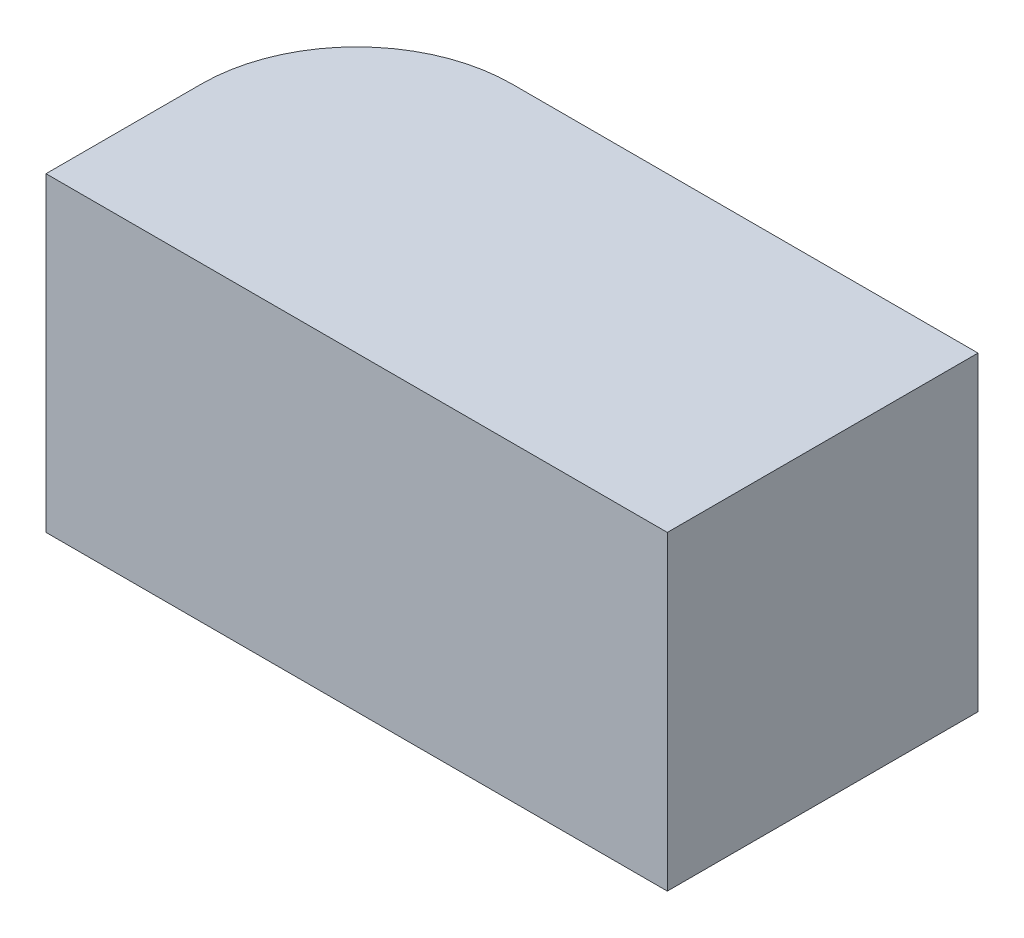
ISO-10303-21;
HEADER;
FILE_DESCRIPTION(('STEP AP214'),'2;1');
FILE_NAME('part.step','',(''),(''),'','','');
FILE_SCHEMA(('AUTOMOTIVE_DESIGN { 1 0 10303 214 1 1 1 1 }'));
ENDSEC;
DATA;
#1=APPLICATION_CONTEXT('core data for automotive mechanical design processes');
#2=APPLICATION_PROTOCOL_DEFINITION('international standard','automotive_design',2000,#1);
#3=PRODUCT_CONTEXT('',#1,'mechanical');
#4=PRODUCT('Part','Part','',(#3));
#5=PRODUCT_RELATED_PRODUCT_CATEGORY('part','',(#4));
#6=PRODUCT_DEFINITION_FORMATION('','',#4);
#7=PRODUCT_DEFINITION_CONTEXT('part definition',#1,'design');
#8=PRODUCT_DEFINITION('design','',#6,#7);
#9=PRODUCT_DEFINITION_SHAPE('','',#8);
#10=(LENGTH_UNIT() NAMED_UNIT(*) SI_UNIT(.MILLI.,.METRE.));
#11=(NAMED_UNIT(*) PLANE_ANGLE_UNIT() SI_UNIT($,.RADIAN.));
#12=(NAMED_UNIT(*) SI_UNIT($,.STERADIAN.) SOLID_ANGLE_UNIT());
#13=UNCERTAINTY_MEASURE_WITH_UNIT(LENGTH_MEASURE(1.E-05),#10,'distance_accuracy_value','');
#14=(GEOMETRIC_REPRESENTATION_CONTEXT(3) GLOBAL_UNCERTAINTY_ASSIGNED_CONTEXT((#13)) GLOBAL_UNIT_ASSIGNED_CONTEXT((#10,
#11,#12)) REPRESENTATION_CONTEXT('',''));
#15=CARTESIAN_POINT('',(0.,0.,0.));
#16=DIRECTION('',(0.,0.,1.));
#17=DIRECTION('',(1.,0.,0.));
#18=AXIS2_PLACEMENT_3D('',#15,#16,#17);
#19=CARTESIAN_POINT('',(-10.,20.,20.));
#20=DIRECTION('',(1.,0.,0.));
#21=DIRECTION('',(0.,0.,-1.));
#22=AXIS2_PLACEMENT_3D('',#19,#20,#21);
#23=PLANE('',#22);
#24=DIRECTION('',(0.,0.,1.));
#25=VECTOR('',#24,1.);
#26=CARTESIAN_POINT('',(-10.,0.,20.));
#27=LINE('',#26,#25);
#28=CARTESIAN_POINT('',(-10.,0.,10.));
#29=VERTEX_POINT('',#28);
#30=CARTESIAN_POINT('',(-10.,0.,20.));
#31=VERTEX_POINT('',#30);
#32=EDGE_CURVE('E118',#29,#31,#27,.T.);
#33=ORIENTED_EDGE('',*,*,#32,.T.);
#34=DIRECTION('',(0.,-1.,0.));
#35=VECTOR('',#34,1.);
#36=CARTESIAN_POINT('',(-10.,20.,20.));
#37=LINE('',#36,#35);
#38=CARTESIAN_POINT('',(-10.,20.,20.));
#39=VERTEX_POINT('',#38);
#40=EDGE_CURVE('E11',#39,#31,#37,.T.);
#41=ORIENTED_EDGE('',*,*,#40,.F.);
#42=DIRECTION('',(0.,0.,1.));
#43=VECTOR('',#42,1.);
#44=CARTESIAN_POINT('',(-10.,20.,20.));
#45=LINE('',#44,#43);
#46=CARTESIAN_POINT('',(-10.,20.,10.));
#47=VERTEX_POINT('',#46);
#48=EDGE_CURVE('E131',#47,#39,#45,.T.);
#49=ORIENTED_EDGE('',*,*,#48,.F.);
#50=DIRECTION('',(0.,-1.,0.));
#51=VECTOR('',#50,1.);
#52=CARTESIAN_POINT('',(-10.,20.,10.));
#53=LINE('',#52,#51);
#54=EDGE_CURVE('E114',#47,#29,#53,.T.);
#55=ORIENTED_EDGE('',*,*,#54,.T.);
#56=EDGE_LOOP('',(#33,#41,#49,#55));
#57=FACE_BOUND('',#56,.T.);
#58=ADVANCED_FACE('F39',(#57),#23,.F.);
#59=CARTESIAN_POINT('',(-10.,20.,20.));
#60=DIRECTION('',(0.,0.,-1.));
#61=DIRECTION('',(-1.,0.,0.));
#62=AXIS2_PLACEMENT_3D('',#59,#60,#61);
#63=PLANE('',#62);
#64=DIRECTION('',(1.,0.,0.));
#65=VECTOR('',#64,1.);
#66=CARTESIAN_POINT('',(-10.,0.,20.));
#67=LINE('',#66,#65);
#68=CARTESIAN_POINT('',(30.,0.,20.));
#69=VERTEX_POINT('',#68);
#70=EDGE_CURVE('E122',#31,#69,#67,.T.);
#71=ORIENTED_EDGE('',*,*,#70,.T.);
#72=DIRECTION('',(0.,-1.,0.));
#73=VECTOR('',#72,1.);
#74=CARTESIAN_POINT('',(30.,20.,20.));
#75=LINE('',#74,#73);
#76=CARTESIAN_POINT('',(30.,20.,20.));
#77=VERTEX_POINT('',#76);
#78=EDGE_CURVE('E48',#77,#69,#75,.T.);
#79=ORIENTED_EDGE('',*,*,#78,.F.);
#80=DIRECTION('',(1.,0.,0.));
#81=VECTOR('',#80,1.);
#82=CARTESIAN_POINT('',(-10.,20.,20.));
#83=LINE('',#82,#81);
#84=EDGE_CURVE('E90',#39,#77,#83,.T.);
#85=ORIENTED_EDGE('',*,*,#84,.F.);
#86=ORIENTED_EDGE('',*,*,#40,.T.);
#87=EDGE_LOOP('',(#71,#79,#85,#86));
#88=FACE_BOUND('',#87,.T.);
#89=ADVANCED_FACE('F153',(#88),#63,.F.);
#90=CARTESIAN_POINT('',(30.,20.,20.));
#91=DIRECTION('',(-1.,0.,0.));
#92=DIRECTION('',(0.,0.,1.));
#93=AXIS2_PLACEMENT_3D('',#90,#91,#92);
#94=PLANE('',#93);
#95=DIRECTION('',(0.,0.,-1.));
#96=VECTOR('',#95,1.);
#97=CARTESIAN_POINT('',(30.,0.,20.));
#98=LINE('',#97,#96);
#99=CARTESIAN_POINT('',(30.,0.,0.));
#100=VERTEX_POINT('',#99);
#101=EDGE_CURVE('E106',#69,#100,#98,.T.);
#102=ORIENTED_EDGE('',*,*,#101,.T.);
#103=DIRECTION('',(0.,-1.,0.));
#104=VECTOR('',#103,1.);
#105=CARTESIAN_POINT('',(30.,20.,0.));
#106=LINE('',#105,#104);
#107=CARTESIAN_POINT('',(30.,20.,0.));
#108=VERTEX_POINT('',#107);
#109=EDGE_CURVE('E103',#108,#100,#106,.T.);
#110=ORIENTED_EDGE('',*,*,#109,.F.);
#111=DIRECTION('',(0.,0.,-1.));
#112=VECTOR('',#111,1.);
#113=CARTESIAN_POINT('',(30.,20.,20.));
#114=LINE('',#113,#112);
#115=EDGE_CURVE('E94',#77,#108,#114,.T.);
#116=ORIENTED_EDGE('',*,*,#115,.F.);
#117=ORIENTED_EDGE('',*,*,#78,.T.);
#118=EDGE_LOOP('',(#102,#110,#116,#117));
#119=FACE_BOUND('',#118,.T.);
#120=ADVANCED_FACE('F104',(#119),#94,.F.);
#121=CARTESIAN_POINT('',(0.,20.,0.));
#122=DIRECTION('',(0.,0.,1.));
#123=DIRECTION('',(1.,0.,0.));
#124=AXIS2_PLACEMENT_3D('',#121,#122,#123);
#125=PLANE('',#124);
#126=DIRECTION('',(-1.,0.,0.));
#127=VECTOR('',#126,1.);
#128=CARTESIAN_POINT('',(0.,0.,0.));
#129=LINE('',#128,#127);
#130=CARTESIAN_POINT('',(0.,0.,0.));
#131=VERTEX_POINT('',#130);
#132=EDGE_CURVE('E76',#100,#131,#129,.T.);
#133=ORIENTED_EDGE('',*,*,#132,.T.);
#134=DIRECTION('',(0.,-1.,0.));
#135=VECTOR('',#134,1.);
#136=CARTESIAN_POINT('',(0.,20.,0.));
#137=LINE('',#136,#135);
#138=CARTESIAN_POINT('',(0.,20.,0.));
#139=VERTEX_POINT('',#138);
#140=EDGE_CURVE('E108',#139,#131,#137,.T.);
#141=ORIENTED_EDGE('',*,*,#140,.F.);
#142=DIRECTION('',(-1.,0.,0.));
#143=VECTOR('',#142,1.);
#144=CARTESIAN_POINT('',(0.,20.,0.));
#145=LINE('',#144,#143);
#146=EDGE_CURVE('E98',#108,#139,#145,.T.);
#147=ORIENTED_EDGE('',*,*,#146,.F.);
#148=ORIENTED_EDGE('',*,*,#109,.T.);
#149=EDGE_LOOP('',(#133,#141,#147,#148));
#150=FACE_BOUND('',#149,.T.);
#151=ADVANCED_FACE('F110',(#150),#125,.F.);
#152=CARTESIAN_POINT('',(0.,20.,10.));
#153=DIRECTION('',(0.,-1.,0.));
#154=DIRECTION('',(0.,0.,-1.));
#155=AXIS2_PLACEMENT_3D('',#152,#153,#154);
#156=CYLINDRICAL_SURFACE('',#155,10.);
#157=CARTESIAN_POINT('',(0.,0.,10.));
#158=DIRECTION('',(0.,1.,0.));
#159=DIRECTION('',(0.,0.,-1.));
#160=AXIS2_PLACEMENT_3D('',#157,#158,#159);
#161=CIRCLE('',#160,10.);
#162=EDGE_CURVE('E82',#131,#29,#161,.T.);
#163=ORIENTED_EDGE('',*,*,#162,.T.);
#164=ORIENTED_EDGE('',*,*,#54,.F.);
#165=CARTESIAN_POINT('',(0.,20.,10.));
#166=DIRECTION('',(0.,1.,0.));
#167=DIRECTION('',(0.,0.,-1.));
#168=AXIS2_PLACEMENT_3D('',#165,#166,#167);
#169=CIRCLE('',#168,10.);
#170=EDGE_CURVE('E56',#139,#47,#169,.T.);
#171=ORIENTED_EDGE('',*,*,#170,.F.);
#172=ORIENTED_EDGE('',*,*,#140,.T.);
#173=EDGE_LOOP('',(#163,#164,#171,#172));
#174=FACE_BOUND('',#173,.T.);
#175=ADVANCED_FACE('F142',(#174),#156,.T.);
#176=CARTESIAN_POINT('',(0.,20.,10.));
#177=DIRECTION('',(0.,-1.,0.));
#178=DIRECTION('',(0.,0.,-1.));
#179=AXIS2_PLACEMENT_3D('',#176,#177,#178);
#180=PLANE('',#179);
#181=ORIENTED_EDGE('',*,*,#48,.T.);
#182=ORIENTED_EDGE('',*,*,#84,.T.);
#183=ORIENTED_EDGE('',*,*,#115,.T.);
#184=ORIENTED_EDGE('',*,*,#146,.T.);
#185=ORIENTED_EDGE('',*,*,#170,.T.);
#186=EDGE_LOOP('',(#181,#182,#183,#184,#185));
#187=FACE_BOUND('',#186,.T.);
#188=ADVANCED_FACE('F96',(#187),#180,.F.);
#189=CARTESIAN_POINT('',(0.,0.,10.));
#190=DIRECTION('',(0.,-1.,0.));
#191=DIRECTION('',(0.,0.,-1.));
#192=AXIS2_PLACEMENT_3D('',#189,#190,#191);
#193=PLANE('',#192);
#194=ORIENTED_EDGE('',*,*,#32,.F.);
#195=ORIENTED_EDGE('',*,*,#162,.F.);
#196=ORIENTED_EDGE('',*,*,#132,.F.);
#197=ORIENTED_EDGE('',*,*,#101,.F.);
#198=ORIENTED_EDGE('',*,*,#70,.F.);
#199=EDGE_LOOP('',(#194,#195,#196,#197,#198));
#200=FACE_BOUND('',#199,.T.);
#201=ADVANCED_FACE('F138',(#200),#193,.T.);
#202=CLOSED_SHELL('',(#58,#89,#120,#151,#175,#188,#201));
#203=MANIFOLD_SOLID_BREP('B2',#202);
#204=ADVANCED_BREP_SHAPE_REPRESENTATION('',(#18,#203),#14);
#205=SHAPE_DEFINITION_REPRESENTATION(#9,#204);
ENDSEC;
END-ISO-10303-21;
